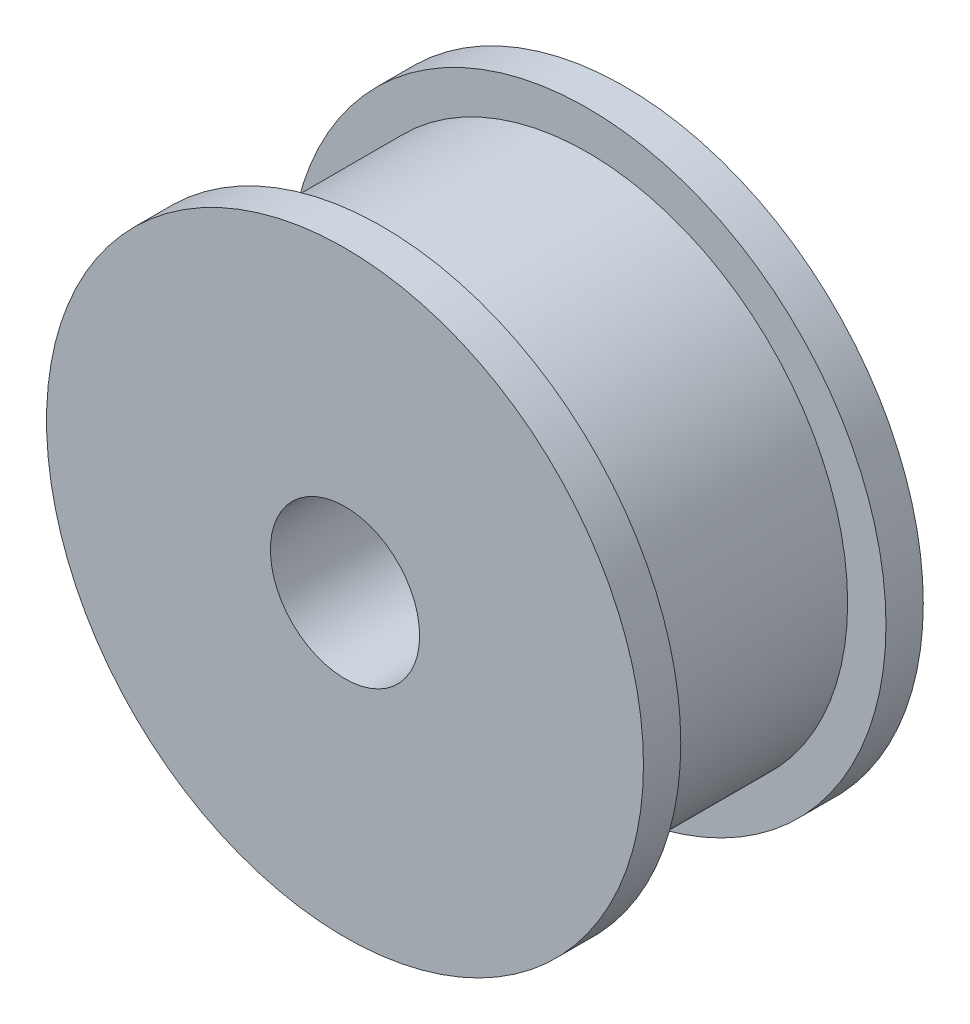
ISO-10303-21;
HEADER;
FILE_DESCRIPTION(('STEP AP214'),'2;1');
FILE_NAME('part.step','',(''),(''),'','','');
FILE_SCHEMA(('AUTOMOTIVE_DESIGN { 1 0 10303 214 1 1 1 1 }'));
ENDSEC;
DATA;
#1=APPLICATION_CONTEXT('core data for automotive mechanical design processes');
#2=APPLICATION_PROTOCOL_DEFINITION('international standard','automotive_design',2000,#1);
#3=PRODUCT_CONTEXT('',#1,'mechanical');
#4=PRODUCT('Part','Part','',(#3));
#5=PRODUCT_RELATED_PRODUCT_CATEGORY('part','',(#4));
#6=PRODUCT_DEFINITION_FORMATION('','',#4);
#7=PRODUCT_DEFINITION_CONTEXT('part definition',#1,'design');
#8=PRODUCT_DEFINITION('design','',#6,#7);
#9=PRODUCT_DEFINITION_SHAPE('','',#8);
#10=(LENGTH_UNIT() NAMED_UNIT(*) SI_UNIT(.MILLI.,.METRE.));
#11=(NAMED_UNIT(*) PLANE_ANGLE_UNIT() SI_UNIT($,.RADIAN.));
#12=(NAMED_UNIT(*) SI_UNIT($,.STERADIAN.) SOLID_ANGLE_UNIT());
#13=UNCERTAINTY_MEASURE_WITH_UNIT(LENGTH_MEASURE(1.E-05),#10,'distance_accuracy_value','');
#14=(GEOMETRIC_REPRESENTATION_CONTEXT(3) GLOBAL_UNCERTAINTY_ASSIGNED_CONTEXT((#13)) GLOBAL_UNIT_ASSIGNED_CONTEXT((#10,
#11,#12)) REPRESENTATION_CONTEXT('',''));
#15=CARTESIAN_POINT('',(0.,0.,0.));
#16=DIRECTION('',(0.,0.,1.));
#17=DIRECTION('',(1.,0.,0.));
#18=AXIS2_PLACEMENT_3D('',#15,#16,#17);
#19=CARTESIAN_POINT('',(0.,0.,2.));
#20=DIRECTION('',(0.,0.,-1.));
#21=DIRECTION('',(-1.,0.,0.));
#22=AXIS2_PLACEMENT_3D('',#19,#20,#21);
#23=CYLINDRICAL_SURFACE('',#22,16.);
#24=CARTESIAN_POINT('',(0.,0.,2.));
#25=DIRECTION('',(0.,0.,1.));
#26=DIRECTION('',(1.,0.,0.));
#27=AXIS2_PLACEMENT_3D('',#24,#25,#26);
#28=CIRCLE('',#27,16.);
#29=CARTESIAN_POINT('',(16.,0.,2.));
#30=VERTEX_POINT('',#29);
#31=EDGE_CURVE('E60',#30,#30,#28,.T.);
#32=ORIENTED_EDGE('',*,*,#31,.F.);
#33=EDGE_LOOP('',(#32));
#34=FACE_BOUND('',#33,.T.);
#35=CARTESIAN_POINT('',(0.,0.,0.));
#36=DIRECTION('',(0.,0.,1.));
#37=DIRECTION('',(1.,0.,0.));
#38=AXIS2_PLACEMENT_3D('',#35,#36,#37);
#39=CIRCLE('',#38,16.);
#40=CARTESIAN_POINT('',(16.,0.,0.));
#41=VERTEX_POINT('',#40);
#42=EDGE_CURVE('E65',#41,#41,#39,.T.);
#43=ORIENTED_EDGE('',*,*,#42,.T.);
#44=EDGE_LOOP('',(#43));
#45=FACE_BOUND('',#44,.T.);
#46=ADVANCED_FACE('F48',(#34,#45),#23,.T.);
#47=CARTESIAN_POINT('',(0.,0.,2.));
#48=DIRECTION('',(0.,0.,1.));
#49=DIRECTION('',(1.,0.,0.));
#50=AXIS2_PLACEMENT_3D('',#47,#48,#49);
#51=PLANE('',#50);
#52=CARTESIAN_POINT('',(0.,0.,2.));
#53=DIRECTION('',(0.,0.,1.));
#54=DIRECTION('',(1.,0.,0.));
#55=AXIS2_PLACEMENT_3D('',#52,#53,#54);
#56=CIRCLE('',#55,13.945);
#57=CARTESIAN_POINT('',(13.945,0.,2.));
#58=VERTEX_POINT('',#57);
#59=EDGE_CURVE('E12',#58,#58,#56,.T.);
#60=ORIENTED_EDGE('',*,*,#59,.F.);
#61=EDGE_LOOP('',(#60));
#62=FACE_BOUND('',#61,.T.);
#63=ORIENTED_EDGE('',*,*,#31,.T.);
#64=EDGE_LOOP('',(#63));
#65=FACE_BOUND('',#64,.T.);
#66=ADVANCED_FACE('F113',(#62,#65),#51,.T.);
#67=CARTESIAN_POINT('',(0.,0.,0.));
#68=DIRECTION('',(0.,0.,1.));
#69=DIRECTION('',(1.,0.,0.));
#70=AXIS2_PLACEMENT_3D('',#67,#68,#69);
#71=PLANE('',#70);
#72=CARTESIAN_POINT('',(0.,0.,0.));
#73=DIRECTION('',(0.,0.,1.));
#74=DIRECTION('',(1.,0.,0.));
#75=AXIS2_PLACEMENT_3D('',#72,#73,#74);
#76=CIRCLE('',#75,4.);
#77=CARTESIAN_POINT('',(4.,0.,0.));
#78=VERTEX_POINT('',#77);
#79=EDGE_CURVE('E102',#78,#78,#76,.T.);
#80=ORIENTED_EDGE('',*,*,#79,.T.);
#81=EDGE_LOOP('',(#80));
#82=FACE_BOUND('',#81,.T.);
#83=ORIENTED_EDGE('',*,*,#42,.F.);
#84=EDGE_LOOP('',(#83));
#85=FACE_BOUND('',#84,.T.);
#86=ADVANCED_FACE('F110',(#82,#85),#71,.F.);
#87=CARTESIAN_POINT('',(0.,0.,13.));
#88=DIRECTION('',(0.,0.,-1.));
#89=DIRECTION('',(-1.,0.,0.));
#90=AXIS2_PLACEMENT_3D('',#87,#88,#89);
#91=CYLINDRICAL_SURFACE('',#90,13.945);
#92=CARTESIAN_POINT('',(-13.945,0.,9.5));
#93=CARTESIAN_POINT('',(-13.9449982655467,-0.111725944881087,9.49999535043122));
#94=CARTESIAN_POINT('',(-13.9436431920022,-0.223518121905761,9.49060638937284));
#95=CARTESIAN_POINT('',(-13.9383679288523,-0.443981632184145,9.45330589604952));
#96=CARTESIAN_POINT('',(-13.9344451909274,-0.552649752951827,9.42537596210905));
#97=CARTESIAN_POINT('',(-13.9244757326362,-0.76364237886481,9.35184193419321));
#98=CARTESIAN_POINT('',(-13.9184305689848,-0.865971468897057,9.30625079148636));
#99=CARTESIAN_POINT('',(-13.9048854651112,-1.06151001299836,9.19871927063412));
#100=CARTESIAN_POINT('',(-13.897385740202,-1.15472081374425,9.13678131175586));
#101=CARTESIAN_POINT('',(-13.8817063382048,-1.3300616267768,8.99784094992483));
#102=CARTESIAN_POINT('',(-13.8735226128042,-1.41211682406785,8.92074457845407));
#103=CARTESIAN_POINT('',(-13.8574295164984,-1.5621720009626,8.75387800901321));
#104=CARTESIAN_POINT('',(-13.8495201608663,-1.63017119916254,8.66410710690485));
#105=CARTESIAN_POINT('',(-13.834831945192,-1.75047203324694,8.4739414372933));
#106=CARTESIAN_POINT('',(-13.8280583146169,-1.802701896444,8.37350082673225));
#107=CARTESIAN_POINT('',(-13.8164633174062,-1.88952287360959,8.16515971008703));
#108=CARTESIAN_POINT('',(-13.8116418535523,-1.9241148659692,8.05725957580174));
#109=CARTESIAN_POINT('',(-13.8045366341998,-1.97444713447729,7.83784652377838));
#110=CARTESIAN_POINT('',(-13.8022357044637,-1.99031504940842,7.72636345192361));
#111=CARTESIAN_POINT('',(-13.8003798364863,-2.00314401871672,7.50229496437047));
#112=CARTESIAN_POINT('',(-13.8008247539011,-2.00010606693928,7.38970960692779));
#113=CARTESIAN_POINT('',(-13.8043945997532,-1.97531397667889,7.167530664799));
#114=CARTESIAN_POINT('',(-13.8074992348458,-1.95370155530977,7.0579208935947));
#115=CARTESIAN_POINT('',(-13.8160070185916,-1.89259566227822,6.8438998341425));
#116=CARTESIAN_POINT('',(-13.8214102271404,-1.85310172466259,6.73948868143792));
#117=CARTESIAN_POINT('',(-13.8339289400293,-1.75720511736295,6.53839498345596));
#118=CARTESIAN_POINT('',(-13.8410505489524,-1.70074198532541,6.44174166675793));
#119=CARTESIAN_POINT('',(-13.8561991469752,-1.57255288207828,6.259227948228));
#120=CARTESIAN_POINT('',(-13.8642261904513,-1.50082599396734,6.17336819526388));
#121=CARTESIAN_POINT('',(-13.8803710383376,-1.34336543087744,6.01405715530256));
#122=CARTESIAN_POINT('',(-13.8884890021574,-1.2575098237008,5.94072634670625));
#123=CARTESIAN_POINT('',(-13.903832789545,-1.07464570955332,5.80949665037276));
#124=CARTESIAN_POINT('',(-13.9110586097879,-0.977637161018896,5.75159782014847));
#125=CARTESIAN_POINT('',(-13.9238105911513,-0.775119683667868,5.65287114178863));
#126=CARTESIAN_POINT('',(-13.9293358753501,-0.669606404455077,5.6120520973623));
#127=CARTESIAN_POINT('',(-13.9380567590545,-0.453125871305182,5.54874587133081));
#128=CARTESIAN_POINT('',(-13.9412525024255,-0.342158954619727,5.52625755766625));
#129=CARTESIAN_POINT('',(-13.9449352790098,-0.118961431261062,5.50041021912956));
#130=CARTESIAN_POINT('',(-13.9454457780248,-0.00675038897306506,5.49688546932927));
#131=CARTESIAN_POINT('',(-13.9437642773937,0.2166610480285,5.50862613849228));
#132=CARTESIAN_POINT('',(-13.9415723540364,0.32786147118233,5.52389102702867));
#133=CARTESIAN_POINT('',(-13.9347468235621,0.545596751155939,5.57263987951943));
#134=CARTESIAN_POINT('',(-13.9301239754049,0.65214994333569,5.60604358451257));
#135=CARTESIAN_POINT('',(-13.9189534759039,0.858143112440643,5.69003756030219));
#136=CARTESIAN_POINT('',(-13.9124057409701,0.957582780220601,5.74062857749002));
#137=CARTESIAN_POINT('',(-13.8980553366504,1.1472581199749,5.85795328605779));
#138=CARTESIAN_POINT('',(-13.8902445663647,1.23742778076889,5.92479268699532));
#139=CARTESIAN_POINT('',(-13.874264016036,1.4053289588581,6.0725690039025));
#140=CARTESIAN_POINT('',(-13.8660942170238,1.48305981794751,6.15350666541614));
#141=CARTESIAN_POINT('',(-13.8502425418994,1.6244757275981,6.32791763946523));
#142=CARTESIAN_POINT('',(-13.8425648264667,1.68805002357053,6.4214811890343));
#143=CARTESIAN_POINT('',(-13.8286388613517,1.79857964993521,6.61805623292917));
#144=CARTESIAN_POINT('',(-13.82239057571,1.84553539840802,6.72106748949248));
#145=CARTESIAN_POINT('',(-13.8120605902263,1.92132120964418,6.93327600223782));
#146=CARTESIAN_POINT('',(-13.8079717917124,1.95021071817875,7.04245166795921));
#147=CARTESIAN_POINT('',(-13.8024044544715,1.98923385843402,7.26416789677154));
#148=CARTESIAN_POINT('',(-13.8009257522239,1.99936866512387,7.37670824861832));
#149=CARTESIAN_POINT('',(-13.800751775432,2.00056854479561,7.60085595836024));
#150=CARTESIAN_POINT('',(-13.8020310901411,1.9918077107637,7.71246240387671));
#151=CARTESIAN_POINT('',(-13.8071739433262,1.95583683286525,7.93259771515098));
#152=CARTESIAN_POINT('',(-13.8110374790295,1.92862680879322,8.04112658421065));
#153=CARTESIAN_POINT('',(-13.8209048536763,1.85658955692229,8.25198480629022));
#154=CARTESIAN_POINT('',(-13.8269073413472,1.81177344985481,8.35431802574034));
#155=CARTESIAN_POINT('',(-13.8403780835011,1.70581339864733,8.55004085937553));
#156=CARTESIAN_POINT('',(-13.8478463789721,1.64466899790683,8.64343022335753));
#157=CARTESIAN_POINT('',(-13.8634893350983,1.50715159888151,8.81950052775766));
#158=CARTESIAN_POINT('',(-13.8716696306741,1.43064939160746,8.90208006101393));
#159=CARTESIAN_POINT('',(-13.8877670585951,1.26486070627031,9.05329221879918));
#160=CARTESIAN_POINT('',(-13.8956841291144,1.17557125053641,9.12192158582665));
#161=CARTESIAN_POINT('',(-13.9104080620764,0.986219027398785,9.24358924430717));
#162=CARTESIAN_POINT('',(-13.9172091614366,0.886104508435573,9.29654767147628));
#163=CARTESIAN_POINT('',(-13.9288779866587,0.678354067742358,9.38482020004785));
#164=CARTESIAN_POINT('',(-13.9337477415888,0.570726180147766,9.420152829212));
#165=CARTESIAN_POINT('',(-13.9398759727421,0.385494842989387,9.46403022878396));
#166=CARTESIAN_POINT('',(-13.9417877583291,0.309042203670669,9.47749862894637));
#167=CARTESIAN_POINT('',(-13.9443503670583,0.155070338741732,9.49548507955022));
#168=CARTESIAN_POINT('',(-13.9450012039173,0.0775511247432515,9.50000322735501));
#169=CARTESIAN_POINT('',(-13.945,0.,9.5));
#170=B_SPLINE_CURVE_WITH_KNOTS('',3,(#92,#93,#94,#95,#96,#97,#98,#99,#100,#101,#102,#103,#104,
#105,#106,#107,#108,#109,#110,#111,#112,#113,#114,#115,#116,#117,#118,#119,#120,#121,#122,#123,
#124,#125,#126,#127,#128,#129,#130,#131,#132,#133,#134,#135,#136,#137,#138,#139,#140,#141,#142,
#143,#144,#145,#146,#147,#148,#149,#150,#151,#152,#153,#154,#155,#156,#157,#158,#159,#160,#161,
#162,#163,#164,#165,#166,#167,#168,#169),.UNSPECIFIED.,.T.,.F.,(4,2,2,2,2,2,2,2,2,2,2,2,2,2,2,2,
2,2,2,2,2,2,2,2,2,2,2,2,2,2,2,2,2,2,2,2,2,2,4),(0.,0.334894486280671,0.670121848927922,
1.00510384751603,1.34003629780493,1.6771144996819,2.01421143543773,2.35282027784864,
2.69141225540951,3.02768252571801,3.36393511908837,3.69764476266522,4.03136310248575,
4.36628489115792,4.70122680442871,5.03922750672538,5.37722946868748,5.71540543846661,
6.05356052177335,6.38875556748366,6.72394115093624,7.05765557953602,7.39138450216532,
7.72734562512789,8.06332451977787,8.40184618887145,8.74035934101194,9.07775269481334,
9.41512491043806,9.74940206946978,10.0836788698493,10.4177448657622,10.7518202043955,
11.0888338092082,11.425926019848,11.764707691787,12.1031324912221,12.335591716681,
12.5680484133688),.UNSPECIFIED.);
#171=CARTESIAN_POINT('',(-13.945,0.,9.5));
#172=VERTEX_POINT('',#171);
#173=EDGE_CURVE('E79',#172,#172,#170,.T.);
#174=ORIENTED_EDGE('',*,*,#173,.T.);
#175=EDGE_LOOP('',(#174));
#176=FACE_BOUND('',#175,.T.);
#177=CARTESIAN_POINT('',(0.,-13.945,9.5));
#178=CARTESIAN_POINT('',(0.111725944881087,-13.9449982655467,9.49999535043122));
#179=CARTESIAN_POINT('',(0.223518121905761,-13.9436431920022,9.49060638937284));
#180=CARTESIAN_POINT('',(0.443981632184145,-13.9383679288523,9.45330589604952));
#181=CARTESIAN_POINT('',(0.552649752951827,-13.9344451909274,9.42537596210905));
#182=CARTESIAN_POINT('',(0.763642378864811,-13.9244757326362,9.35184193419321));
#183=CARTESIAN_POINT('',(0.865971468897056,-13.9184305689848,9.30625079148636));
#184=CARTESIAN_POINT('',(1.06151001299836,-13.9048854651112,9.19871927063412));
#185=CARTESIAN_POINT('',(1.15472081374425,-13.897385740202,9.13678131175586));
#186=CARTESIAN_POINT('',(1.3300616267768,-13.8817063382048,8.99784094992483));
#187=CARTESIAN_POINT('',(1.41211682406784,-13.8735226128042,8.92074457845407));
#188=CARTESIAN_POINT('',(1.5621720009626,-13.8574295164984,8.75387800901321));
#189=CARTESIAN_POINT('',(1.63017119916254,-13.8495201608663,8.66410710690485));
#190=CARTESIAN_POINT('',(1.75047203324694,-13.834831945192,8.4739414372933));
#191=CARTESIAN_POINT('',(1.802701896444,-13.8280583146169,8.37350082673225));
#192=CARTESIAN_POINT('',(1.88952287360959,-13.8164633174062,8.16515971008703));
#193=CARTESIAN_POINT('',(1.9241148659692,-13.8116418535523,8.05725957580175));
#194=CARTESIAN_POINT('',(1.97444713447729,-13.8045366341998,7.83784652377838));
#195=CARTESIAN_POINT('',(1.99031504940842,-13.8022357044637,7.72636345192361));
#196=CARTESIAN_POINT('',(2.00314401871672,-13.8003798364863,7.50229496437047));
#197=CARTESIAN_POINT('',(2.00010606693928,-13.8008247539011,7.38970960692779));
#198=CARTESIAN_POINT('',(1.97531397667889,-13.8043945997532,7.167530664799));
#199=CARTESIAN_POINT('',(1.95370155530977,-13.8074992348458,7.0579208935947));
#200=CARTESIAN_POINT('',(1.89259566227822,-13.8160070185916,6.8438998341425));
#201=CARTESIAN_POINT('',(1.85310172466259,-13.8214102271404,6.73948868143792));
#202=CARTESIAN_POINT('',(1.75720511736295,-13.8339289400293,6.53839498345596));
#203=CARTESIAN_POINT('',(1.70074198532541,-13.8410505489524,6.44174166675793));
#204=CARTESIAN_POINT('',(1.57255288207828,-13.8561991469752,6.259227948228));
#205=CARTESIAN_POINT('',(1.50082599396734,-13.8642261904513,6.17336819526388));
#206=CARTESIAN_POINT('',(1.34336543087744,-13.8803710383376,6.01405715530256));
#207=CARTESIAN_POINT('',(1.2575098237008,-13.8884890021574,5.94072634670625));
#208=CARTESIAN_POINT('',(1.07464570955332,-13.903832789545,5.80949665037276));
#209=CARTESIAN_POINT('',(0.977637161018895,-13.9110586097879,5.75159782014847));
#210=CARTESIAN_POINT('',(0.775119683667867,-13.9238105911513,5.65287114178863));
#211=CARTESIAN_POINT('',(0.669606404455077,-13.9293358753501,5.6120520973623));
#212=CARTESIAN_POINT('',(0.453125871305181,-13.9380567590545,5.54874587133081));
#213=CARTESIAN_POINT('',(0.342158954619726,-13.9412525024255,5.52625755766625));
#214=CARTESIAN_POINT('',(0.118961431261061,-13.9449352790098,5.50041021912956));
#215=CARTESIAN_POINT('',(0.00675038897306411,-13.9454457780248,5.49688546932927));
#216=CARTESIAN_POINT('',(-0.216661048028501,-13.9437642773937,5.50862613849228));
#217=CARTESIAN_POINT('',(-0.32786147118233,-13.9415723540364,5.52389102702867));
#218=CARTESIAN_POINT('',(-0.545596751155938,-13.9347468235621,5.57263987951943));
#219=CARTESIAN_POINT('',(-0.652149943335689,-13.9301239754049,5.60604358451257));
#220=CARTESIAN_POINT('',(-0.858143112440642,-13.9189534759039,5.69003756030219));
#221=CARTESIAN_POINT('',(-0.9575827802206,-13.9124057409701,5.74062857749002));
#222=CARTESIAN_POINT('',(-1.1472581199749,-13.8980553366504,5.85795328605779));
#223=CARTESIAN_POINT('',(-1.23742778076889,-13.8902445663647,5.92479268699532));
#224=CARTESIAN_POINT('',(-1.4053289588581,-13.874264016036,6.0725690039025));
#225=CARTESIAN_POINT('',(-1.48305981794751,-13.8660942170238,6.15350666541614));
#226=CARTESIAN_POINT('',(-1.6244757275981,-13.8502425418994,6.32791763946523));
#227=CARTESIAN_POINT('',(-1.68805002357053,-13.8425648264667,6.4214811890343));
#228=CARTESIAN_POINT('',(-1.79857964993521,-13.8286388613517,6.61805623292917));
#229=CARTESIAN_POINT('',(-1.84553539840802,-13.82239057571,6.72106748949248));
#230=CARTESIAN_POINT('',(-1.92132120964418,-13.8120605902263,6.93327600223782));
#231=CARTESIAN_POINT('',(-1.95021071817875,-13.8079717917124,7.04245166795921));
#232=CARTESIAN_POINT('',(-1.98923385843402,-13.8024044544715,7.26416789677155));
#233=CARTESIAN_POINT('',(-1.99936866512387,-13.8009257522239,7.37670824861832));
#234=CARTESIAN_POINT('',(-2.00056854479561,-13.800751775432,7.60085595836024));
#235=CARTESIAN_POINT('',(-1.9918077107637,-13.8020310901411,7.71246240387671));
#236=CARTESIAN_POINT('',(-1.95583683286525,-13.8071739433262,7.93259771515098));
#237=CARTESIAN_POINT('',(-1.92862680879322,-13.8110374790295,8.04112658421065));
#238=CARTESIAN_POINT('',(-1.85658955692229,-13.8209048536763,8.25198480629022));
#239=CARTESIAN_POINT('',(-1.81177344985481,-13.8269073413472,8.35431802574033));
#240=CARTESIAN_POINT('',(-1.70581339864734,-13.8403780835011,8.55004085937553));
#241=CARTESIAN_POINT('',(-1.64466899790683,-13.8478463789721,8.64343022335753));
#242=CARTESIAN_POINT('',(-1.50715159888151,-13.8634893350983,8.81950052775766));
#243=CARTESIAN_POINT('',(-1.43064939160746,-13.8716696306741,8.90208006101393));
#244=CARTESIAN_POINT('',(-1.26486070627031,-13.8877670585951,9.05329221879918));
#245=CARTESIAN_POINT('',(-1.17557125053641,-13.8956841291144,9.12192158582665));
#246=CARTESIAN_POINT('',(-0.986219027398784,-13.9104080620764,9.24358924430717));
#247=CARTESIAN_POINT('',(-0.886104508435573,-13.9172091614366,9.29654767147628));
#248=CARTESIAN_POINT('',(-0.678354067742358,-13.9288779866587,9.38482020004785));
#249=CARTESIAN_POINT('',(-0.570726180147766,-13.9337477415888,9.420152829212));
#250=CARTESIAN_POINT('',(-0.385494842989387,-13.9398759727421,9.46403022878395));
#251=CARTESIAN_POINT('',(-0.309042203670669,-13.9417877583291,9.47749862894637));
#252=CARTESIAN_POINT('',(-0.155070338741732,-13.9443503670583,9.49548507955022));
#253=CARTESIAN_POINT('',(-0.0775511247432517,-13.9450012039173,9.50000322735501));
#254=CARTESIAN_POINT('',(0.,-13.945,9.5));
#255=B_SPLINE_CURVE_WITH_KNOTS('',3,(#177,#178,#179,#180,#181,#182,#183,#184,#185,#186,#187,
#188,#189,#190,#191,#192,#193,#194,#195,#196,#197,#198,#199,#200,#201,#202,#203,#204,#205,#206,
#207,#208,#209,#210,#211,#212,#213,#214,#215,#216,#217,#218,#219,#220,#221,#222,#223,#224,#225,
#226,#227,#228,#229,#230,#231,#232,#233,#234,#235,#236,#237,#238,#239,#240,#241,#242,#243,#244,
#245,#246,#247,#248,#249,#250,#251,#252,#253,#254),.UNSPECIFIED.,.T.,.F.,(4,2,2,2,2,2,2,2,2,2,2,
2,2,2,2,2,2,2,2,2,2,2,2,2,2,2,2,2,2,2,2,2,2,2,2,2,2,2,4),(0.,0.334894486280671,
0.670121848927922,1.00510384751603,1.34003629780493,1.6771144996819,2.01421143543773,
2.35282027784864,2.69141225540951,3.02768252571801,3.36393511908837,3.69764476266522,
4.03136310248575,4.36628489115792,4.70122680442871,5.03922750672538,5.37722946868748,
5.71540543846661,6.05356052177335,6.38875556748366,6.72394115093624,7.05765557953602,
7.39138450216532,7.72734562512789,8.06332451977787,8.40184618887145,8.74035934101194,
9.07775269481334,9.41512491043806,9.74940206946978,10.0836788698493,10.4177448657622,
10.7518202043955,11.0888338092082,11.425926019848,11.764707691787,12.1031324912221,
12.335591716681,12.5680484133688),.UNSPECIFIED.);
#256=CARTESIAN_POINT('',(0.,-13.945,9.5));
#257=VERTEX_POINT('',#256);
#258=EDGE_CURVE('E78',#257,#257,#255,.T.);
#259=ORIENTED_EDGE('',*,*,#258,.T.);
#260=EDGE_LOOP('',(#259));
#261=FACE_BOUND('',#260,.T.);
#262=CARTESIAN_POINT('',(0.,0.,13.));
#263=DIRECTION('',(0.,0.,1.));
#264=DIRECTION('',(1.,0.,0.));
#265=AXIS2_PLACEMENT_3D('',#262,#263,#264);
#266=CIRCLE('',#265,13.945);
#267=CARTESIAN_POINT('',(13.945,0.,13.));
#268=VERTEX_POINT('',#267);
#269=EDGE_CURVE('E68',#268,#268,#266,.T.);
#270=ORIENTED_EDGE('',*,*,#269,.F.);
#271=EDGE_LOOP('',(#270));
#272=FACE_BOUND('',#271,.T.);
#273=ORIENTED_EDGE('',*,*,#59,.T.);
#274=EDGE_LOOP('',(#273));
#275=FACE_BOUND('',#274,.T.);
#276=ADVANCED_FACE('F104',(#176,#261,#272,#275),#91,.T.);
#277=CARTESIAN_POINT('',(0.,0.,15.));
#278=DIRECTION('',(0.,0.,-1.));
#279=DIRECTION('',(-1.,0.,0.));
#280=AXIS2_PLACEMENT_3D('',#277,#278,#279);
#281=CYLINDRICAL_SURFACE('',#280,16.);
#282=CARTESIAN_POINT('',(0.,0.,15.));
#283=DIRECTION('',(0.,0.,1.));
#284=DIRECTION('',(1.,0.,0.));
#285=AXIS2_PLACEMENT_3D('',#282,#283,#284);
#286=CIRCLE('',#285,16.);
#287=CARTESIAN_POINT('',(16.,0.,15.));
#288=VERTEX_POINT('',#287);
#289=EDGE_CURVE('E211',#288,#288,#286,.T.);
#290=ORIENTED_EDGE('',*,*,#289,.F.);
#291=EDGE_LOOP('',(#290));
#292=FACE_BOUND('',#291,.T.);
#293=CARTESIAN_POINT('',(0.,0.,13.));
#294=DIRECTION('',(0.,0.,1.));
#295=DIRECTION('',(1.,0.,0.));
#296=AXIS2_PLACEMENT_3D('',#293,#294,#295);
#297=CIRCLE('',#296,16.);
#298=CARTESIAN_POINT('',(16.,0.,13.));
#299=VERTEX_POINT('',#298);
#300=EDGE_CURVE('E209',#299,#299,#297,.T.);
#301=ORIENTED_EDGE('',*,*,#300,.T.);
#302=EDGE_LOOP('',(#301));
#303=FACE_BOUND('',#302,.T.);
#304=ADVANCED_FACE('F109',(#292,#303),#281,.T.);
#305=CARTESIAN_POINT('',(0.,0.,15.));
#306=DIRECTION('',(0.,0.,1.));
#307=DIRECTION('',(1.,0.,0.));
#308=AXIS2_PLACEMENT_3D('',#305,#306,#307);
#309=PLANE('',#308);
#310=CARTESIAN_POINT('',(0.,0.,15.));
#311=DIRECTION('',(0.,0.,1.));
#312=DIRECTION('',(1.,0.,0.));
#313=AXIS2_PLACEMENT_3D('',#310,#311,#312);
#314=CIRCLE('',#313,4.);
#315=CARTESIAN_POINT('',(4.,0.,15.));
#316=VERTEX_POINT('',#315);
#317=EDGE_CURVE('E98',#316,#316,#314,.T.);
#318=ORIENTED_EDGE('',*,*,#317,.F.);
#319=EDGE_LOOP('',(#318));
#320=FACE_BOUND('',#319,.T.);
#321=ORIENTED_EDGE('',*,*,#289,.T.);
#322=EDGE_LOOP('',(#321));
#323=FACE_BOUND('',#322,.T.);
#324=ADVANCED_FACE('F145',(#320,#323),#309,.T.);
#325=CARTESIAN_POINT('',(0.,0.,13.));
#326=DIRECTION('',(0.,0.,1.));
#327=DIRECTION('',(1.,0.,0.));
#328=AXIS2_PLACEMENT_3D('',#325,#326,#327);
#329=PLANE('',#328);
#330=ORIENTED_EDGE('',*,*,#269,.T.);
#331=EDGE_LOOP('',(#330));
#332=FACE_BOUND('',#331,.T.);
#333=ORIENTED_EDGE('',*,*,#300,.F.);
#334=EDGE_LOOP('',(#333));
#335=FACE_BOUND('',#334,.T.);
#336=ADVANCED_FACE('F153',(#332,#335),#329,.F.);
#337=CARTESIAN_POINT('',(0.,0.,0.));
#338=DIRECTION('',(0.,0.,1.));
#339=DIRECTION('',(1.,0.,0.));
#340=AXIS2_PLACEMENT_3D('',#337,#338,#339);
#341=CYLINDRICAL_SURFACE('',#340,4.);
#342=CARTESIAN_POINT('',(-4.,0.,5.5));
#343=CARTESIAN_POINT('',(-3.99999426810082,-0.105143925902467,5.50000660463438));
#344=CARTESIAN_POINT('',(-3.99580982039513,-0.210413199395125,5.50834014624211));
#345=CARTESIAN_POINT('',(-3.97948312074314,-0.417840470537792,5.54130576068307));
#346=CARTESIAN_POINT('',(-3.96732575657839,-0.519992173427259,5.56596878599563));
#347=CARTESIAN_POINT('',(-3.93632558806751,-0.717867089760898,5.63038761723326));
#348=CARTESIAN_POINT('',(-3.91750878355075,-0.813613605878293,5.67008476849593));
#349=CARTESIAN_POINT('',(-3.87491553031523,-0.996945233613197,5.76314124272997));
#350=CARTESIAN_POINT('',(-3.85113947267051,-1.08453098798012,5.81649948849773));
#351=CARTESIAN_POINT('',(-3.79912516516124,-1.25501563552382,5.93903449897057));
#352=CARTESIAN_POINT('',(-3.77070398255074,-1.33731042224422,6.00897295847928));
#353=CARTESIAN_POINT('',(-3.71319940493486,-1.48955888973396,6.16104295849407));
#354=CARTESIAN_POINT('',(-3.68411552418069,-1.55950316621353,6.24318370354488));
#355=CARTESIAN_POINT('',(-3.62597902394695,-1.69050400090056,6.42496669904676));
#356=CARTESIAN_POINT('',(-3.59710373940264,-1.75045067110327,6.52547219669182));
#357=CARTESIAN_POINT('',(-3.54571957544641,-1.85233645378139,6.73673467197243));
#358=CARTESIAN_POINT('',(-3.52320615213979,-1.89428842993267,6.8474842574455));
#359=CARTESIAN_POINT('',(-3.48915734075617,-1.95626488437718,7.06933021084385));
#360=CARTESIAN_POINT('',(-3.47704543167427,-1.97745171416088,7.18000890413479));
#361=CARTESIAN_POINT('',(-3.46363779897055,-2.00085398661769,7.40395767555895));
#362=CARTESIAN_POINT('',(-3.46233138686576,-2.00308817674615,7.51722508174231));
#363=CARTESIAN_POINT('',(-3.47021860514497,-1.98937457434459,7.72857204863074));
#364=CARTESIAN_POINT('',(-3.47817527324027,-1.97556911907364,7.8268480624461));
#365=CARTESIAN_POINT('',(-3.501524574677,-1.93387969811386,8.01944381874609));
#366=CARTESIAN_POINT('',(-3.51691957663553,-1.9059912477953,8.11376229061063));
#367=CARTESIAN_POINT('',(-3.55374952825482,-1.83641956077201,8.29845826513132));
#368=CARTESIAN_POINT('',(-3.57531681327997,-1.79443013423199,8.38869279757158));
#369=CARTESIAN_POINT('',(-3.62206808562807,-1.698083375336,8.56126858518002));
#370=CARTESIAN_POINT('',(-3.64725369560381,-1.64372048762493,8.64360627120018));
#371=CARTESIAN_POINT('',(-3.70226315806572,-1.51613210982558,8.80904250548645));
#372=CARTESIAN_POINT('',(-3.73227020473492,-1.44138891673856,8.89091374715232));
#373=CARTESIAN_POINT('',(-3.79095246600814,-1.27911115748275,9.0414708371818));
#374=CARTESIAN_POINT('',(-3.81962703917602,-1.19157051314857,9.11015038406777));
#375=CARTESIAN_POINT('',(-3.87403974565928,-1.0010330116637,9.23537132205946));
#376=CARTESIAN_POINT('',(-3.89957968324014,-0.897507183198819,9.29120094489148));
#377=CARTESIAN_POINT('',(-3.94315762242484,-0.680932430977594,9.38419405808602));
#378=CARTESIAN_POINT('',(-3.96120157887106,-0.567891152530552,9.42137237003033));
#379=CARTESIAN_POINT('',(-3.98648667482871,-0.345532983321404,9.47295080743335));
#380=CARTESIAN_POINT('',(-3.9944987660262,-0.236683061096652,9.48898247149356));
#381=CARTESIAN_POINT('',(-4.00146026918207,-0.0175591998987034,9.50292946226898));
#382=CARTESIAN_POINT('',(-4.00041397442637,0.0927140397398172,9.50085337127894));
#383=CARTESIAN_POINT('',(-3.9898238450687,0.302465943971973,9.47958662316251));
#384=CARTESIAN_POINT('',(-3.98094491376337,0.40211881609986,9.46173493454001));
#385=CARTESIAN_POINT('',(-3.95644342629681,0.596813784603882,9.41152385620976));
#386=CARTESIAN_POINT('',(-3.94082012668824,0.691855371382174,9.37916286709301));
#387=CARTESIAN_POINT('',(-3.90368502827176,0.877777216899145,9.30000306713393));
#388=CARTESIAN_POINT('',(-3.88201763539262,0.968460794011606,9.25281789976743));
#389=CARTESIAN_POINT('',(-3.83487948634835,1.14092272339854,9.14578492870687));
#390=CARTESIAN_POINT('',(-3.80940711133877,1.22269725955318,9.08593173080921));
#391=CARTESIAN_POINT('',(-3.75416442672396,1.38353537857843,8.94847914933857));
#392=CARTESIAN_POINT('',(-3.72421769686998,1.46154415563805,8.86971426310971));
#393=CARTESIAN_POINT('',(-3.6652478321764,1.60371264223771,8.70014969744455));
#394=CARTESIAN_POINT('',(-3.63622534800094,1.66786277142375,8.60934176230416));
#395=CARTESIAN_POINT('',(-3.58102384412979,1.78341582895804,8.41271269165405));
#396=CARTESIAN_POINT('',(-3.55505059178121,1.8340509916005,8.30637746781104));
#397=CARTESIAN_POINT('',(-3.51148144588269,1.91616565186941,8.08497986485007));
#398=CARTESIAN_POINT('',(-3.493874764435,1.94766983173403,7.96992894706622));
#399=CARTESIAN_POINT('',(-3.47123002051604,1.98772337493374,7.74617955423059));
#400=CARTESIAN_POINT('',(-3.4651476693013,1.9981859928109,7.63793149312952));
#401=CARTESIAN_POINT('',(-3.46330709283206,2.00137830875241,7.42110586567095));
#402=CARTESIAN_POINT('',(-3.4675443925278,1.99411569324648,7.31252846252428));
#403=CARTESIAN_POINT('',(-3.48475724102153,1.96385225118662,7.10903299693313));
#404=CARTESIAN_POINT('',(-3.49686188965317,1.94241662868607,7.01379905971052));
#405=CARTESIAN_POINT('',(-3.52742032375305,1.88635071644882,6.82838376115127));
#406=CARTESIAN_POINT('',(-3.54587615139337,1.85171618231984,6.73820403581594));
#407=CARTESIAN_POINT('',(-3.58857060729071,1.76763149060113,6.55875029802693));
#408=CARTESIAN_POINT('',(-3.61311444791841,1.7173422756314,6.46994419634194));
#409=CARTESIAN_POINT('',(-3.66470663269721,1.60430194327479,6.30145092763748));
#410=CARTESIAN_POINT('',(-3.69175627591221,1.54154434248312,6.22176853895778));
#411=CARTESIAN_POINT('',(-3.74924646316184,1.39640665332275,6.06371603529065));
#412=CARTESIAN_POINT('',(-3.77969966613256,1.31256884599452,5.98668179529942));
#413=CARTESIAN_POINT('',(-3.83755504519861,1.1323096124664,5.84747403312946));
#414=CARTESIAN_POINT('',(-3.8649555725239,1.0358814466104,5.78530852106019));
#415=CARTESIAN_POINT('',(-3.91396019133075,0.831863193565893,5.67752727457586));
#416=CARTESIAN_POINT('',(-3.93552192987866,0.724199007553462,5.63203166152706));
#417=CARTESIAN_POINT('',(-3.97002682597974,0.501484202276174,5.56038366448518));
#418=CARTESIAN_POINT('',(-3.98299446726136,0.386455599178201,5.53417630638857));
#419=CARTESIAN_POINT('',(-3.99390923826956,0.225203892981791,5.51220517782852));
#420=CARTESIAN_POINT('',(-3.99618730680502,0.18032375888313,5.50763471826732));
#421=CARTESIAN_POINT('',(-3.99923393953631,0.090303463610183,5.50153066897183));
#422=CARTESIAN_POINT('',(-4.00000246206762,0.0451632952932568,5.49999716305958));
#423=CARTESIAN_POINT('',(-4.,0.,5.5));
#424=B_SPLINE_CURVE_WITH_KNOTS('',3,(#342,#343,#344,#345,#346,#347,#348,#349,#350,#351,#352,
#353,#354,#355,#356,#357,#358,#359,#360,#361,#362,#363,#364,#365,#366,#367,#368,#369,#370,#371,
#372,#373,#374,#375,#376,#377,#378,#379,#380,#381,#382,#383,#384,#385,#386,#387,#388,#389,#390,
#391,#392,#393,#394,#395,#396,#397,#398,#399,#400,#401,#402,#403,#404,#405,#406,#407,#408,#409,
#410,#411,#412,#413,#414,#415,#416,#417,#418,#419,#420,#421,#422,#423),.UNSPECIFIED.,.T.,.F.,(4,
2,2,2,2,2,2,2,2,2,2,2,2,2,2,2,2,2,2,2,2,2,2,2,2,2,2,2,2,2,2,2,2,2,2,2,2,2,2,2,4),(0.,
0.315248514840585,0.631096299418395,0.945724310984597,1.26032752116314,1.59396351743618,
1.92785247530807,2.28763452861505,2.64715895796562,2.98516024280459,3.32282714658041,
3.62011424818641,3.91749607851357,4.22180480336975,4.52625042520444,4.86929882667757,
5.21251069197373,5.57166044428881,5.93052433824559,6.25966580942691,6.58865129022952,
6.89213813012244,7.19565843261863,7.50785712055797,7.82018901496679,8.16319221288838,
8.50643177230864,8.86629364323452,9.22569023890902,9.55058615006093,9.87534119729357,
10.1691586049771,10.463070575767,10.7767291356057,11.0905512228726,11.4425048551434,
11.7946476676249,12.1492802732705,12.502898172423,12.6383056026783,12.7737167702213),.UNSPECIFIED.);
#425=CARTESIAN_POINT('',(-4.,0.,5.5));
#426=VERTEX_POINT('',#425);
#427=EDGE_CURVE('E51',#426,#426,#424,.T.);
#428=ORIENTED_EDGE('',*,*,#427,.T.);
#429=EDGE_LOOP('',(#428));
#430=FACE_BOUND('',#429,.T.);
#431=CARTESIAN_POINT('',(0.,-4.,9.5));
#432=CARTESIAN_POINT('',(-0.105143925902467,-3.99999426810082,9.49999339536562));
#433=CARTESIAN_POINT('',(-0.210413199395125,-3.99580982039513,9.49165985375789));
#434=CARTESIAN_POINT('',(-0.417840470537792,-3.97948312074314,9.45869423931692));
#435=CARTESIAN_POINT('',(-0.519992173427259,-3.96732575657839,9.43403121400437));
#436=CARTESIAN_POINT('',(-0.717867089760898,-3.93632558806751,9.36961238276674));
#437=CARTESIAN_POINT('',(-0.813613605878293,-3.91750878355075,9.32991523150407));
#438=CARTESIAN_POINT('',(-0.996945233613197,-3.87491553031523,9.23685875727003));
#439=CARTESIAN_POINT('',(-1.08453098798012,-3.85113947267051,9.18350051150227));
#440=CARTESIAN_POINT('',(-1.25501563552382,-3.79912516516124,9.06096550102943));
#441=CARTESIAN_POINT('',(-1.33731042224422,-3.77070398255074,8.99102704152072));
#442=CARTESIAN_POINT('',(-1.48955888973396,-3.71319940493486,8.83895704150593));
#443=CARTESIAN_POINT('',(-1.55950316621353,-3.68411552418069,8.75681629645512));
#444=CARTESIAN_POINT('',(-1.69050400090055,-3.62597902394695,8.57503330095324));
#445=CARTESIAN_POINT('',(-1.75045067110327,-3.59710373940264,8.47452780330818));
#446=CARTESIAN_POINT('',(-1.85233645378139,-3.54571957544641,8.26326532802757));
#447=CARTESIAN_POINT('',(-1.89428842993267,-3.52320615213979,8.1525157425545));
#448=CARTESIAN_POINT('',(-1.95626488437718,-3.48915734075617,7.93066978915615));
#449=CARTESIAN_POINT('',(-1.97745171416088,-3.47704543167427,7.81999109586521));
#450=CARTESIAN_POINT('',(-2.00085398661769,-3.46363779897055,7.59604232444105));
#451=CARTESIAN_POINT('',(-2.00308817674615,-3.46233138686576,7.48277491825769));
#452=CARTESIAN_POINT('',(-1.98937457434459,-3.47021860514497,7.27142795136926));
#453=CARTESIAN_POINT('',(-1.97556911907364,-3.47817527324027,7.1731519375539));
#454=CARTESIAN_POINT('',(-1.93387969811386,-3.50152457467701,6.98055618125392));
#455=CARTESIAN_POINT('',(-1.9059912477953,-3.51691957663553,6.88623770938937));
#456=CARTESIAN_POINT('',(-1.83641956077201,-3.55374952825482,6.70154173486868));
#457=CARTESIAN_POINT('',(-1.79443013423199,-3.57531681327997,6.61130720242842));
#458=CARTESIAN_POINT('',(-1.698083375336,-3.62206808562807,6.43873141481998));
#459=CARTESIAN_POINT('',(-1.64372048762493,-3.64725369560381,6.35639372879982));
#460=CARTESIAN_POINT('',(-1.51613210982558,-3.70226315806572,6.19095749451355));
#461=CARTESIAN_POINT('',(-1.44138891673856,-3.73227020473492,6.10908625284769));
#462=CARTESIAN_POINT('',(-1.27911115748275,-3.79095246600814,5.9585291628182));
#463=CARTESIAN_POINT('',(-1.19157051314857,-3.81962703917602,5.88984961593223));
#464=CARTESIAN_POINT('',(-1.0010330116637,-3.87403974565928,5.76462867794055));
#465=CARTESIAN_POINT('',(-0.897507183198818,-3.89957968324015,5.70879905510852));
#466=CARTESIAN_POINT('',(-0.680932430977593,-3.94315762242485,5.61580594191398));
#467=CARTESIAN_POINT('',(-0.567891152530552,-3.96120157887106,5.57862762996967));
#468=CARTESIAN_POINT('',(-0.345532983321405,-3.98648667482871,5.52704919256665));
#469=CARTESIAN_POINT('',(-0.236683061096653,-3.9944987660262,5.51101752850644));
#470=CARTESIAN_POINT('',(-0.0175591998987036,-4.00146026918207,5.49707053773102));
#471=CARTESIAN_POINT('',(0.092714039739817,-4.00041397442637,5.49914662872106));
#472=CARTESIAN_POINT('',(0.302465943971973,-3.9898238450687,5.52041337683749));
#473=CARTESIAN_POINT('',(0.40211881609986,-3.98094491376337,5.53826506545999));
#474=CARTESIAN_POINT('',(0.596813784603882,-3.95644342629681,5.58847614379024));
#475=CARTESIAN_POINT('',(0.691855371382173,-3.94082012668824,5.62083713290699));
#476=CARTESIAN_POINT('',(0.877777216899145,-3.90368502827176,5.69999693286607));
#477=CARTESIAN_POINT('',(0.968460794011606,-3.88201763539262,5.74718210023257));
#478=CARTESIAN_POINT('',(1.14092272339854,-3.83487948634835,5.85421507129313));
#479=CARTESIAN_POINT('',(1.22269725955318,-3.80940711133877,5.91406826919079));
#480=CARTESIAN_POINT('',(1.38353537857843,-3.75416442672396,6.05152085066143));
#481=CARTESIAN_POINT('',(1.46154415563805,-3.72421769686998,6.13028573689029));
#482=CARTESIAN_POINT('',(1.60371264223771,-3.6652478321764,6.29985030255545));
#483=CARTESIAN_POINT('',(1.66786277142375,-3.63622534800094,6.39065823769584));
#484=CARTESIAN_POINT('',(1.78341582895804,-3.58102384412979,6.58728730834595));
#485=CARTESIAN_POINT('',(1.8340509916005,-3.55505059178121,6.69362253218896));
#486=CARTESIAN_POINT('',(1.91616565186941,-3.51148144588269,6.91502013514993));
#487=CARTESIAN_POINT('',(1.94766983173403,-3.493874764435,7.03007105293378));
#488=CARTESIAN_POINT('',(1.98772337493374,-3.47123002051604,7.25382044576941));
#489=CARTESIAN_POINT('',(1.9981859928109,-3.4651476693013,7.36206850687048));
#490=CARTESIAN_POINT('',(2.0013783087524,-3.46330709283206,7.57889413432905));
#491=CARTESIAN_POINT('',(1.99411569324648,-3.4675443925278,7.68747153747572));
#492=CARTESIAN_POINT('',(1.96385225118662,-3.48475724102153,7.89096700306687));
#493=CARTESIAN_POINT('',(1.94241662868607,-3.49686188965317,7.98620094028948));
#494=CARTESIAN_POINT('',(1.88635071644882,-3.52742032375305,8.17161623884873));
#495=CARTESIAN_POINT('',(1.85171618231984,-3.54587615139337,8.26179596418406));
#496=CARTESIAN_POINT('',(1.76763149060113,-3.58857060729071,8.44124970197307));
#497=CARTESIAN_POINT('',(1.7173422756314,-3.61311444791841,8.53005580365806));
#498=CARTESIAN_POINT('',(1.60430194327478,-3.66470663269721,8.69854907236252));
#499=CARTESIAN_POINT('',(1.54154434248312,-3.69175627591221,8.77823146104222));
#500=CARTESIAN_POINT('',(1.39640665332275,-3.74924646316184,8.93628396470935));
#501=CARTESIAN_POINT('',(1.31256884599452,-3.77969966613256,9.01331820470058));
#502=CARTESIAN_POINT('',(1.13230961246639,-3.83755504519861,9.15252596687054));
#503=CARTESIAN_POINT('',(1.0358814466104,-3.8649555725239,9.21469147893981));
#504=CARTESIAN_POINT('',(0.831863193565892,-3.91396019133075,9.32247272542414));
#505=CARTESIAN_POINT('',(0.724199007553462,-3.93552192987866,9.36796833847293));
#506=CARTESIAN_POINT('',(0.501484202276173,-3.97002682597974,9.43961633551482));
#507=CARTESIAN_POINT('',(0.3864555991782,-3.98299446726136,9.46582369361143));
#508=CARTESIAN_POINT('',(0.22520389298179,-3.99390923826956,9.48779482217148));
#509=CARTESIAN_POINT('',(0.18032375888313,-3.99618730680502,9.49236528173268));
#510=CARTESIAN_POINT('',(0.0903034636101831,-3.99923393953631,9.49846933102817));
#511=CARTESIAN_POINT('',(0.0451632952932568,-4.00000246206762,9.50000283694042));
#512=CARTESIAN_POINT('',(0.,-4.,9.5));
#513=B_SPLINE_CURVE_WITH_KNOTS('',3,(#431,#432,#433,#434,#435,#436,#437,#438,#439,#440,#441,
#442,#443,#444,#445,#446,#447,#448,#449,#450,#451,#452,#453,#454,#455,#456,#457,#458,#459,#460,
#461,#462,#463,#464,#465,#466,#467,#468,#469,#470,#471,#472,#473,#474,#475,#476,#477,#478,#479,
#480,#481,#482,#483,#484,#485,#486,#487,#488,#489,#490,#491,#492,#493,#494,#495,#496,#497,#498,
#499,#500,#501,#502,#503,#504,#505,#506,#507,#508,#509,#510,#511,#512),.UNSPECIFIED.,.T.,.F.,(4,
2,2,2,2,2,2,2,2,2,2,2,2,2,2,2,2,2,2,2,2,2,2,2,2,2,2,2,2,2,2,2,2,2,2,2,2,2,2,2,4),(0.,
0.315248514840585,0.631096299418395,0.945724310984596,1.26032752116314,1.59396351743618,
1.92785247530807,2.28763452861505,2.64715895796562,2.98516024280459,3.32282714658041,
3.62011424818641,3.91749607851357,4.22180480336975,4.52625042520444,4.86929882667757,
5.21251069197372,5.57166044428881,5.93052433824559,6.25966580942691,6.58865129022952,
6.89213813012244,7.19565843261863,7.50785712055797,7.82018901496678,8.16319221288837,
8.50643177230863,8.86629364323451,9.22569023890901,9.55058615006093,9.87534119729357,
10.1691586049771,10.463070575767,10.7767291356057,11.0905512228726,11.4425048551434,
11.7946476676249,12.1492802732705,12.502898172423,12.6383056026783,12.7737167702213),.UNSPECIFIED.);
#514=CARTESIAN_POINT('',(0.,-4.,9.5));
#515=VERTEX_POINT('',#514);
#516=EDGE_CURVE('E72',#515,#515,#513,.T.);
#517=ORIENTED_EDGE('',*,*,#516,.T.);
#518=EDGE_LOOP('',(#517));
#519=FACE_BOUND('',#518,.T.);
#520=ORIENTED_EDGE('',*,*,#79,.F.);
#521=EDGE_LOOP('',(#520));
#522=FACE_BOUND('',#521,.T.);
#523=ORIENTED_EDGE('',*,*,#317,.T.);
#524=EDGE_LOOP('',(#523));
#525=FACE_BOUND('',#524,.T.);
#526=ADVANCED_FACE('F80',(#430,#519,#522,#525),#341,.F.);
#527=CARTESIAN_POINT('',(0.,-20.,7.5));
#528=DIRECTION('',(0.,1.,0.));
#529=DIRECTION('',(0.,0.,1.));
#530=AXIS2_PLACEMENT_3D('',#527,#528,#529);
#531=CYLINDRICAL_SURFACE('',#530,2.);
#532=ORIENTED_EDGE('',*,*,#516,.F.);
#533=EDGE_LOOP('',(#532));
#534=FACE_BOUND('',#533,.T.);
#535=ORIENTED_EDGE('',*,*,#258,.F.);
#536=EDGE_LOOP('',(#535));
#537=FACE_BOUND('',#536,.T.);
#538=ADVANCED_FACE('F83',(#534,#537),#531,.F.);
#539=CARTESIAN_POINT('',(-20.,0.,7.5));
#540=DIRECTION('',(1.,0.,0.));
#541=DIRECTION('',(0.,0.,-1.));
#542=AXIS2_PLACEMENT_3D('',#539,#540,#541);
#543=CYLINDRICAL_SURFACE('',#542,2.);
#544=ORIENTED_EDGE('',*,*,#427,.F.);
#545=EDGE_LOOP('',(#544));
#546=FACE_BOUND('',#545,.T.);
#547=ORIENTED_EDGE('',*,*,#173,.F.);
#548=EDGE_LOOP('',(#547));
#549=FACE_BOUND('',#548,.T.);
#550=ADVANCED_FACE('F86',(#546,#549),#543,.F.);
#551=CLOSED_SHELL('',(#46,#66,#86,#276,#304,#324,#336,#526,#538,#550));
#552=MANIFOLD_SOLID_BREP('B2',#551);
#553=ADVANCED_BREP_SHAPE_REPRESENTATION('',(#18,#552),#14);
#554=SHAPE_DEFINITION_REPRESENTATION(#9,#553);
ENDSEC;
END-ISO-10303-21;
